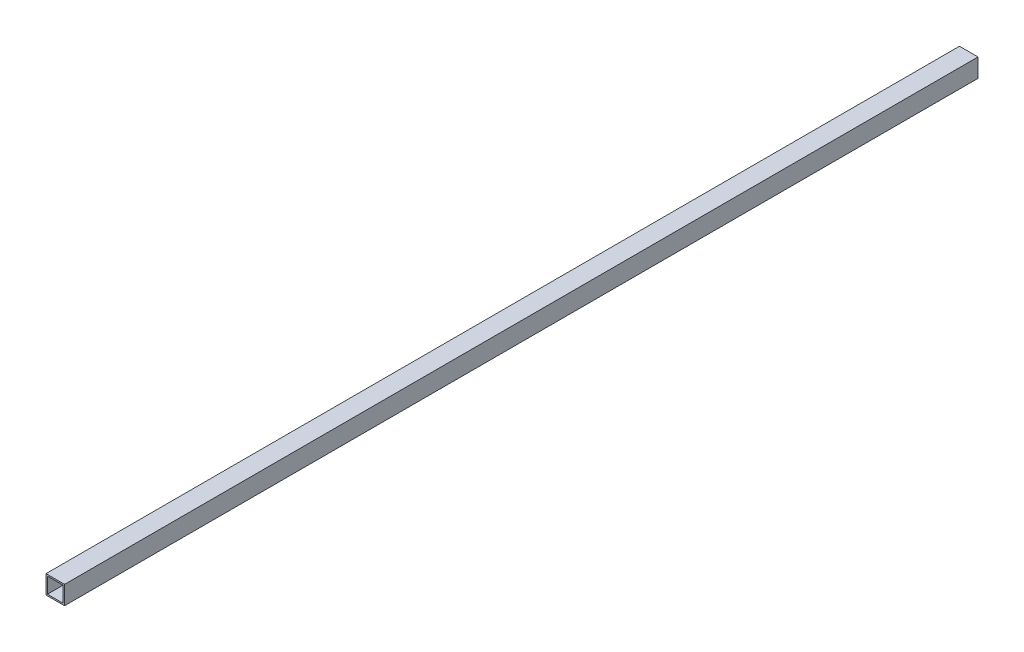
ISO-10303-21;
HEADER;
FILE_DESCRIPTION(('STEP AP214'),'2;1');
FILE_NAME('part.step','',(''),(''),'','','');
FILE_SCHEMA(('AUTOMOTIVE_DESIGN { 1 0 10303 214 1 1 1 1 }'));
ENDSEC;
DATA;
#1=APPLICATION_CONTEXT('core data for automotive mechanical design processes');
#2=APPLICATION_PROTOCOL_DEFINITION('international standard','automotive_design',2000,#1);
#3=PRODUCT_CONTEXT('',#1,'mechanical');
#4=PRODUCT('Part','Part','',(#3));
#5=PRODUCT_RELATED_PRODUCT_CATEGORY('part','',(#4));
#6=PRODUCT_DEFINITION_FORMATION('','',#4);
#7=PRODUCT_DEFINITION_CONTEXT('part definition',#1,'design');
#8=PRODUCT_DEFINITION('design','',#6,#7);
#9=PRODUCT_DEFINITION_SHAPE('','',#8);
#10=(LENGTH_UNIT() NAMED_UNIT(*) SI_UNIT(.MILLI.,.METRE.));
#11=(NAMED_UNIT(*) PLANE_ANGLE_UNIT() SI_UNIT($,.RADIAN.));
#12=(NAMED_UNIT(*) SI_UNIT($,.STERADIAN.) SOLID_ANGLE_UNIT());
#13=UNCERTAINTY_MEASURE_WITH_UNIT(LENGTH_MEASURE(1.E-05),#10,'distance_accuracy_value','');
#14=(GEOMETRIC_REPRESENTATION_CONTEXT(3) GLOBAL_UNCERTAINTY_ASSIGNED_CONTEXT((#13)) GLOBAL_UNIT_ASSIGNED_CONTEXT((#10,
#11,#12)) REPRESENTATION_CONTEXT('',''));
#15=CARTESIAN_POINT('',(0.,0.,0.));
#16=DIRECTION('',(0.,0.,1.));
#17=DIRECTION('',(1.,0.,0.));
#18=AXIS2_PLACEMENT_3D('',#15,#16,#17);
#19=CARTESIAN_POINT('',(0.,0.,1250.));
#20=DIRECTION('',(0.,0.,1.));
#21=DIRECTION('',(1.,0.,0.));
#22=AXIS2_PLACEMENT_3D('',#19,#20,#21);
#23=PLANE('',#22);
#24=DIRECTION('',(0.,-1.,0.));
#25=VECTOR('',#24,1.);
#26=CARTESIAN_POINT('',(-12.7,12.7,1250.));
#27=LINE('',#26,#25);
#28=CARTESIAN_POINT('',(-12.7,12.7,1250.));
#29=VERTEX_POINT('',#28);
#30=CARTESIAN_POINT('',(-12.7,-12.7,1250.));
#31=VERTEX_POINT('',#30);
#32=EDGE_CURVE('E133',#29,#31,#27,.T.);
#33=ORIENTED_EDGE('',*,*,#32,.T.);
#34=DIRECTION('',(1.,0.,0.));
#35=VECTOR('',#34,1.);
#36=CARTESIAN_POINT('',(-12.7,-12.7,1250.));
#37=LINE('',#36,#35);
#38=CARTESIAN_POINT('',(12.7,-12.7,1250.));
#39=VERTEX_POINT('',#38);
#40=EDGE_CURVE('E136',#31,#39,#37,.T.);
#41=ORIENTED_EDGE('',*,*,#40,.T.);
#42=DIRECTION('',(0.,-1.,0.));
#43=VECTOR('',#42,1.);
#44=CARTESIAN_POINT('',(12.7,12.7,1250.));
#45=LINE('',#44,#43);
#46=CARTESIAN_POINT('',(12.7,12.7,1250.));
#47=VERTEX_POINT('',#46);
#48=EDGE_CURVE('E139',#47,#39,#45,.T.);
#49=ORIENTED_EDGE('',*,*,#48,.F.);
#50=DIRECTION('',(1.,0.,0.));
#51=VECTOR('',#50,1.);
#52=CARTESIAN_POINT('',(-12.7,12.7,1250.));
#53=LINE('',#52,#51);
#54=EDGE_CURVE('E142',#29,#47,#53,.T.);
#55=ORIENTED_EDGE('',*,*,#54,.F.);
#56=EDGE_LOOP('',(#33,#41,#49,#55));
#57=FACE_BOUND('',#56,.T.);
#58=DIRECTION('',(1.,0.,0.));
#59=VECTOR('',#58,1.);
#60=CARTESIAN_POINT('',(-10.7,-10.7,1250.));
#61=LINE('',#60,#59);
#62=CARTESIAN_POINT('',(-10.7,-10.7,1250.));
#63=VERTEX_POINT('',#62);
#64=CARTESIAN_POINT('',(10.7,-10.7,1250.));
#65=VERTEX_POINT('',#64);
#66=EDGE_CURVE('E107',#63,#65,#61,.T.);
#67=ORIENTED_EDGE('',*,*,#66,.F.);
#68=DIRECTION('',(0.,-1.,0.));
#69=VECTOR('',#68,1.);
#70=CARTESIAN_POINT('',(-10.7,10.7,1250.));
#71=LINE('',#70,#69);
#72=CARTESIAN_POINT('',(-10.7,10.7,1250.));
#73=VERTEX_POINT('',#72);
#74=EDGE_CURVE('E98',#73,#63,#71,.T.);
#75=ORIENTED_EDGE('',*,*,#74,.F.);
#76=DIRECTION('',(1.,0.,0.));
#77=VECTOR('',#76,1.);
#78=CARTESIAN_POINT('',(-10.7,10.7,1250.));
#79=LINE('',#78,#77);
#80=CARTESIAN_POINT('',(10.7,10.7,1250.));
#81=VERTEX_POINT('',#80);
#82=EDGE_CURVE('E118',#73,#81,#79,.T.);
#83=ORIENTED_EDGE('',*,*,#82,.T.);
#84=DIRECTION('',(0.,-1.,0.));
#85=VECTOR('',#84,1.);
#86=CARTESIAN_POINT('',(10.7,10.7,1250.));
#87=LINE('',#86,#85);
#88=EDGE_CURVE('E48',#81,#65,#87,.T.);
#89=ORIENTED_EDGE('',*,*,#88,.T.);
#90=EDGE_LOOP('',(#67,#75,#83,#89));
#91=FACE_BOUND('',#90,.T.);
#92=ADVANCED_FACE('F33',(#57,#91),#23,.T.);
#93=CARTESIAN_POINT('',(0.,0.,0.));
#94=DIRECTION('',(0.,0.,1.));
#95=DIRECTION('',(1.,0.,0.));
#96=AXIS2_PLACEMENT_3D('',#93,#94,#95);
#97=PLANE('',#96);
#98=DIRECTION('',(0.,-1.,0.));
#99=VECTOR('',#98,1.);
#100=CARTESIAN_POINT('',(-12.7,12.7,0.));
#101=LINE('',#100,#99);
#102=CARTESIAN_POINT('',(-12.7,12.7,0.));
#103=VERTEX_POINT('',#102);
#104=CARTESIAN_POINT('',(-12.7,-12.7,0.));
#105=VERTEX_POINT('',#104);
#106=EDGE_CURVE('E114',#103,#105,#101,.T.);
#107=ORIENTED_EDGE('',*,*,#106,.F.);
#108=DIRECTION('',(1.,0.,0.));
#109=VECTOR('',#108,1.);
#110=CARTESIAN_POINT('',(-12.7,12.7,0.));
#111=LINE('',#110,#109);
#112=CARTESIAN_POINT('',(12.7,12.7,0.));
#113=VERTEX_POINT('',#112);
#114=EDGE_CURVE('E137',#103,#113,#111,.T.);
#115=ORIENTED_EDGE('',*,*,#114,.T.);
#116=DIRECTION('',(0.,-1.,0.));
#117=VECTOR('',#116,1.);
#118=CARTESIAN_POINT('',(12.7,12.7,0.));
#119=LINE('',#118,#117);
#120=CARTESIAN_POINT('',(12.7,-12.7,0.));
#121=VERTEX_POINT('',#120);
#122=EDGE_CURVE('E151',#113,#121,#119,.T.);
#123=ORIENTED_EDGE('',*,*,#122,.T.);
#124=DIRECTION('',(1.,0.,0.));
#125=VECTOR('',#124,1.);
#126=CARTESIAN_POINT('',(-12.7,-12.7,0.));
#127=LINE('',#126,#125);
#128=EDGE_CURVE('E148',#105,#121,#127,.T.);
#129=ORIENTED_EDGE('',*,*,#128,.F.);
#130=EDGE_LOOP('',(#107,#115,#123,#129));
#131=FACE_BOUND('',#130,.T.);
#132=DIRECTION('',(0.,-1.,0.));
#133=VECTOR('',#132,1.);
#134=CARTESIAN_POINT('',(-10.7,10.7,0.));
#135=LINE('',#134,#133);
#136=CARTESIAN_POINT('',(-10.7,10.7,0.));
#137=VERTEX_POINT('',#136);
#138=CARTESIAN_POINT('',(-10.7,-10.7,0.));
#139=VERTEX_POINT('',#138);
#140=EDGE_CURVE('E56',#137,#139,#135,.T.);
#141=ORIENTED_EDGE('',*,*,#140,.T.);
#142=DIRECTION('',(1.,0.,0.));
#143=VECTOR('',#142,1.);
#144=CARTESIAN_POINT('',(-10.7,-10.7,0.));
#145=LINE('',#144,#143);
#146=CARTESIAN_POINT('',(10.7,-10.7,0.));
#147=VERTEX_POINT('',#146);
#148=EDGE_CURVE('E113',#139,#147,#145,.T.);
#149=ORIENTED_EDGE('',*,*,#148,.T.);
#150=DIRECTION('',(0.,-1.,0.));
#151=VECTOR('',#150,1.);
#152=CARTESIAN_POINT('',(10.7,10.7,0.));
#153=LINE('',#152,#151);
#154=CARTESIAN_POINT('',(10.7,10.7,0.));
#155=VERTEX_POINT('',#154);
#156=EDGE_CURVE('E124',#155,#147,#153,.T.);
#157=ORIENTED_EDGE('',*,*,#156,.F.);
#158=DIRECTION('',(1.,0.,0.));
#159=VECTOR('',#158,1.);
#160=CARTESIAN_POINT('',(-10.7,10.7,0.));
#161=LINE('',#160,#159);
#162=EDGE_CURVE('E108',#137,#155,#161,.T.);
#163=ORIENTED_EDGE('',*,*,#162,.F.);
#164=EDGE_LOOP('',(#141,#149,#157,#163));
#165=FACE_BOUND('',#164,.T.);
#166=ADVANCED_FACE('F168',(#131,#165),#97,.F.);
#167=CARTESIAN_POINT('',(-12.7,12.7,1250.));
#168=DIRECTION('',(1.,0.,0.));
#169=DIRECTION('',(0.,1.,0.));
#170=AXIS2_PLACEMENT_3D('',#167,#168,#169);
#171=PLANE('',#170);
#172=ORIENTED_EDGE('',*,*,#106,.T.);
#173=DIRECTION('',(0.,0.,-1.));
#174=VECTOR('',#173,1.);
#175=CARTESIAN_POINT('',(-12.7,-12.7,1250.));
#176=LINE('',#175,#174);
#177=EDGE_CURVE('E11',#31,#105,#176,.T.);
#178=ORIENTED_EDGE('',*,*,#177,.F.);
#179=ORIENTED_EDGE('',*,*,#32,.F.);
#180=DIRECTION('',(0.,0.,-1.));
#181=VECTOR('',#180,1.);
#182=CARTESIAN_POINT('',(-12.7,12.7,1250.));
#183=LINE('',#182,#181);
#184=EDGE_CURVE('E145',#29,#103,#183,.T.);
#185=ORIENTED_EDGE('',*,*,#184,.T.);
#186=EDGE_LOOP('',(#172,#178,#179,#185));
#187=FACE_BOUND('',#186,.T.);
#188=ADVANCED_FACE('F35',(#187),#171,.F.);
#189=CARTESIAN_POINT('',(-12.7,-12.7,1250.));
#190=DIRECTION('',(0.,1.,0.));
#191=DIRECTION('',(0.,0.,1.));
#192=AXIS2_PLACEMENT_3D('',#189,#190,#191);
#193=PLANE('',#192);
#194=ORIENTED_EDGE('',*,*,#128,.T.);
#195=DIRECTION('',(0.,0.,-1.));
#196=VECTOR('',#195,1.);
#197=CARTESIAN_POINT('',(12.7,-12.7,1250.));
#198=LINE('',#197,#196);
#199=EDGE_CURVE('E41',#39,#121,#198,.T.);
#200=ORIENTED_EDGE('',*,*,#199,.F.);
#201=ORIENTED_EDGE('',*,*,#40,.F.);
#202=ORIENTED_EDGE('',*,*,#177,.T.);
#203=EDGE_LOOP('',(#194,#200,#201,#202));
#204=FACE_BOUND('',#203,.T.);
#205=ADVANCED_FACE('F164',(#204),#193,.F.);
#206=CARTESIAN_POINT('',(12.7,12.7,1250.));
#207=DIRECTION('',(1.,0.,0.));
#208=DIRECTION('',(0.,1.,0.));
#209=AXIS2_PLACEMENT_3D('',#206,#207,#208);
#210=PLANE('',#209);
#211=ORIENTED_EDGE('',*,*,#122,.F.);
#212=DIRECTION('',(0.,0.,-1.));
#213=VECTOR('',#212,1.);
#214=CARTESIAN_POINT('',(12.7,12.7,1250.));
#215=LINE('',#214,#213);
#216=EDGE_CURVE('E157',#47,#113,#215,.T.);
#217=ORIENTED_EDGE('',*,*,#216,.F.);
#218=ORIENTED_EDGE('',*,*,#48,.T.);
#219=ORIENTED_EDGE('',*,*,#199,.T.);
#220=EDGE_LOOP('',(#211,#217,#218,#219));
#221=FACE_BOUND('',#220,.T.);
#222=ADVANCED_FACE('F161',(#221),#210,.T.);
#223=CARTESIAN_POINT('',(-12.7,12.7,1250.));
#224=DIRECTION('',(0.,1.,0.));
#225=DIRECTION('',(0.,0.,1.));
#226=AXIS2_PLACEMENT_3D('',#223,#224,#225);
#227=PLANE('',#226);
#228=ORIENTED_EDGE('',*,*,#114,.F.);
#229=ORIENTED_EDGE('',*,*,#184,.F.);
#230=ORIENTED_EDGE('',*,*,#54,.T.);
#231=ORIENTED_EDGE('',*,*,#216,.T.);
#232=EDGE_LOOP('',(#228,#229,#230,#231));
#233=FACE_BOUND('',#232,.T.);
#234=ADVANCED_FACE('F172',(#233),#227,.T.);
#235=CARTESIAN_POINT('',(-10.7,10.7,1250.));
#236=DIRECTION('',(1.,0.,0.));
#237=DIRECTION('',(0.,0.,-1.));
#238=AXIS2_PLACEMENT_3D('',#235,#236,#237);
#239=PLANE('',#238);
#240=ORIENTED_EDGE('',*,*,#140,.F.);
#241=DIRECTION('',(0.,0.,-1.));
#242=VECTOR('',#241,1.);
#243=CARTESIAN_POINT('',(-10.7,10.7,1250.));
#244=LINE('',#243,#242);
#245=EDGE_CURVE('E102',#73,#137,#244,.T.);
#246=ORIENTED_EDGE('',*,*,#245,.F.);
#247=ORIENTED_EDGE('',*,*,#74,.T.);
#248=DIRECTION('',(0.,0.,-1.));
#249=VECTOR('',#248,1.);
#250=CARTESIAN_POINT('',(-10.7,-10.7,1250.));
#251=LINE('',#250,#249);
#252=EDGE_CURVE('E101',#63,#139,#251,.T.);
#253=ORIENTED_EDGE('',*,*,#252,.T.);
#254=EDGE_LOOP('',(#240,#246,#247,#253));
#255=FACE_BOUND('',#254,.T.);
#256=ADVANCED_FACE('F100',(#255),#239,.T.);
#257=CARTESIAN_POINT('',(-10.7,-10.7,1250.));
#258=DIRECTION('',(0.,1.,0.));
#259=DIRECTION('',(-1.,0.,0.));
#260=AXIS2_PLACEMENT_3D('',#257,#258,#259);
#261=PLANE('',#260);
#262=ORIENTED_EDGE('',*,*,#148,.F.);
#263=ORIENTED_EDGE('',*,*,#252,.F.);
#264=ORIENTED_EDGE('',*,*,#66,.T.);
#265=DIRECTION('',(0.,0.,-1.));
#266=VECTOR('',#265,1.);
#267=CARTESIAN_POINT('',(10.7,-10.7,1250.));
#268=LINE('',#267,#266);
#269=EDGE_CURVE('E115',#65,#147,#268,.T.);
#270=ORIENTED_EDGE('',*,*,#269,.T.);
#271=EDGE_LOOP('',(#262,#263,#264,#270));
#272=FACE_BOUND('',#271,.T.);
#273=ADVANCED_FACE('F111',(#272),#261,.T.);
#274=CARTESIAN_POINT('',(10.7,10.7,1250.));
#275=DIRECTION('',(1.,0.,0.));
#276=DIRECTION('',(0.,1.,0.));
#277=AXIS2_PLACEMENT_3D('',#274,#275,#276);
#278=PLANE('',#277);
#279=ORIENTED_EDGE('',*,*,#156,.T.);
#280=ORIENTED_EDGE('',*,*,#269,.F.);
#281=ORIENTED_EDGE('',*,*,#88,.F.);
#282=DIRECTION('',(0.,0.,-1.));
#283=VECTOR('',#282,1.);
#284=CARTESIAN_POINT('',(10.7,10.7,1250.));
#285=LINE('',#284,#283);
#286=EDGE_CURVE('E130',#81,#155,#285,.T.);
#287=ORIENTED_EDGE('',*,*,#286,.T.);
#288=EDGE_LOOP('',(#279,#280,#281,#287));
#289=FACE_BOUND('',#288,.T.);
#290=ADVANCED_FACE('F213',(#289),#278,.F.);
#291=CARTESIAN_POINT('',(-10.7,10.7,1250.));
#292=DIRECTION('',(0.,1.,0.));
#293=DIRECTION('',(0.,0.,1.));
#294=AXIS2_PLACEMENT_3D('',#291,#292,#293);
#295=PLANE('',#294);
#296=ORIENTED_EDGE('',*,*,#162,.T.);
#297=ORIENTED_EDGE('',*,*,#286,.F.);
#298=ORIENTED_EDGE('',*,*,#82,.F.);
#299=ORIENTED_EDGE('',*,*,#245,.T.);
#300=EDGE_LOOP('',(#296,#297,#298,#299));
#301=FACE_BOUND('',#300,.T.);
#302=ADVANCED_FACE('F219',(#301),#295,.F.);
#303=CLOSED_SHELL('',(#92,#166,#188,#205,#222,#234,#256,#273,#290,#302));
#304=MANIFOLD_SOLID_BREP('B2',#303);
#305=ADVANCED_BREP_SHAPE_REPRESENTATION('',(#18,#304),#14);
#306=SHAPE_DEFINITION_REPRESENTATION(#9,#305);
ENDSEC;
END-ISO-10303-21;
